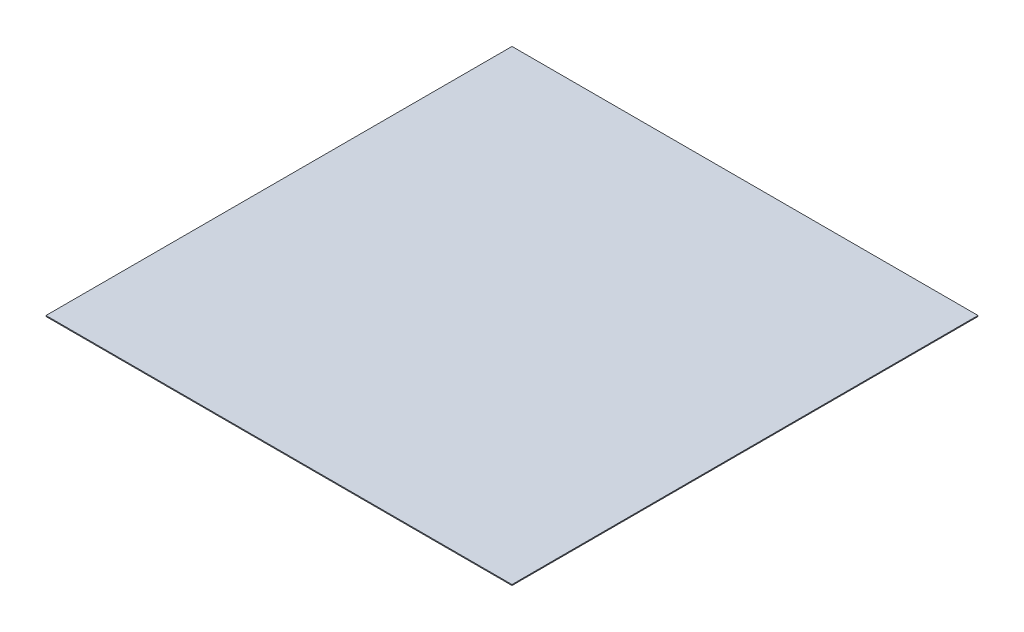
ISO-10303-21;
HEADER;
FILE_DESCRIPTION(('STEP AP214'),'2;1');
FILE_NAME('part.step','',(''),(''),'','','');
FILE_SCHEMA(('AUTOMOTIVE_DESIGN { 1 0 10303 214 1 1 1 1 }'));
ENDSEC;
DATA;
#1=APPLICATION_CONTEXT('core data for automotive mechanical design processes');
#2=APPLICATION_PROTOCOL_DEFINITION('international standard','automotive_design',2000,#1);
#3=PRODUCT_CONTEXT('',#1,'mechanical');
#4=PRODUCT('Part','Part','',(#3));
#5=PRODUCT_RELATED_PRODUCT_CATEGORY('part','',(#4));
#6=PRODUCT_DEFINITION_FORMATION('','',#4);
#7=PRODUCT_DEFINITION_CONTEXT('part definition',#1,'design');
#8=PRODUCT_DEFINITION('design','',#6,#7);
#9=PRODUCT_DEFINITION_SHAPE('','',#8);
#10=(LENGTH_UNIT() NAMED_UNIT(*) SI_UNIT(.MILLI.,.METRE.));
#11=(NAMED_UNIT(*) PLANE_ANGLE_UNIT() SI_UNIT($,.RADIAN.));
#12=(NAMED_UNIT(*) SI_UNIT($,.STERADIAN.) SOLID_ANGLE_UNIT());
#13=UNCERTAINTY_MEASURE_WITH_UNIT(LENGTH_MEASURE(1.E-05),#10,'distance_accuracy_value','');
#14=(GEOMETRIC_REPRESENTATION_CONTEXT(3) GLOBAL_UNCERTAINTY_ASSIGNED_CONTEXT((#13)) GLOBAL_UNIT_ASSIGNED_CONTEXT((#10,
#11,#12)) REPRESENTATION_CONTEXT('',''));
#15=CARTESIAN_POINT('',(0.,0.,0.));
#16=DIRECTION('',(0.,0.,1.));
#17=DIRECTION('',(1.,0.,0.));
#18=AXIS2_PLACEMENT_3D('',#15,#16,#17);
#19=CARTESIAN_POINT('',(0.,2.,0.));
#20=DIRECTION('',(-1.,0.,0.));
#21=DIRECTION('',(0.,0.,1.));
#22=AXIS2_PLACEMENT_3D('',#19,#20,#21);
#23=PLANE('',#22);
#24=DIRECTION('',(0.,0.,-1.));
#25=VECTOR('',#24,1.);
#26=CARTESIAN_POINT('',(0.,0.,0.));
#27=LINE('',#26,#25);
#28=CARTESIAN_POINT('',(0.,0.,0.));
#29=VERTEX_POINT('',#28);
#30=CARTESIAN_POINT('',(0.,0.,-1000.));
#31=VERTEX_POINT('',#30);
#32=EDGE_CURVE('E98',#29,#31,#27,.T.);
#33=ORIENTED_EDGE('',*,*,#32,.F.);
#34=DIRECTION('',(0.,-1.,0.));
#35=VECTOR('',#34,1.);
#36=CARTESIAN_POINT('',(0.,2.,0.));
#37=LINE('',#36,#35);
#38=CARTESIAN_POINT('',(0.,2.,0.));
#39=VERTEX_POINT('',#38);
#40=EDGE_CURVE('E11',#39,#29,#37,.T.);
#41=ORIENTED_EDGE('',*,*,#40,.F.);
#42=DIRECTION('',(0.,0.,-1.));
#43=VECTOR('',#42,1.);
#44=CARTESIAN_POINT('',(0.,2.,0.));
#45=LINE('',#44,#43);
#46=CARTESIAN_POINT('',(0.,2.,-1000.));
#47=VERTEX_POINT('',#46);
#48=EDGE_CURVE('E93',#39,#47,#45,.T.);
#49=ORIENTED_EDGE('',*,*,#48,.T.);
#50=DIRECTION('',(0.,-1.,0.));
#51=VECTOR('',#50,1.);
#52=CARTESIAN_POINT('',(0.,2.,-1000.));
#53=LINE('',#52,#51);
#54=EDGE_CURVE('E36',#47,#31,#53,.T.);
#55=ORIENTED_EDGE('',*,*,#54,.T.);
#56=EDGE_LOOP('',(#33,#41,#49,#55));
#57=FACE_BOUND('',#56,.T.);
#58=ADVANCED_FACE('F33',(#57),#23,.T.);
#59=CARTESIAN_POINT('',(0.,2.,0.));
#60=DIRECTION('',(0.,0.,-1.));
#61=DIRECTION('',(-1.,0.,0.));
#62=AXIS2_PLACEMENT_3D('',#59,#60,#61);
#63=PLANE('',#62);
#64=DIRECTION('',(1.,0.,0.));
#65=VECTOR('',#64,1.);
#66=CARTESIAN_POINT('',(0.,0.,0.));
#67=LINE('',#66,#65);
#68=CARTESIAN_POINT('',(1000.,0.,0.));
#69=VERTEX_POINT('',#68);
#70=EDGE_CURVE('E66',#29,#69,#67,.T.);
#71=ORIENTED_EDGE('',*,*,#70,.T.);
#72=DIRECTION('',(0.,-1.,0.));
#73=VECTOR('',#72,1.);
#74=CARTESIAN_POINT('',(1000.,2.,0.));
#75=LINE('',#74,#73);
#76=CARTESIAN_POINT('',(1000.,2.,0.));
#77=VERTEX_POINT('',#76);
#78=EDGE_CURVE('E42',#77,#69,#75,.T.);
#79=ORIENTED_EDGE('',*,*,#78,.F.);
#80=DIRECTION('',(1.,0.,0.));
#81=VECTOR('',#80,1.);
#82=CARTESIAN_POINT('',(0.,2.,0.));
#83=LINE('',#82,#81);
#84=EDGE_CURVE('E83',#39,#77,#83,.T.);
#85=ORIENTED_EDGE('',*,*,#84,.F.);
#86=ORIENTED_EDGE('',*,*,#40,.T.);
#87=EDGE_LOOP('',(#71,#79,#85,#86));
#88=FACE_BOUND('',#87,.T.);
#89=ADVANCED_FACE('F108',(#88),#63,.F.);
#90=CARTESIAN_POINT('',(1000.,2.,0.));
#91=DIRECTION('',(-1.,0.,0.));
#92=DIRECTION('',(0.,0.,1.));
#93=AXIS2_PLACEMENT_3D('',#90,#91,#92);
#94=PLANE('',#93);
#95=DIRECTION('',(0.,0.,-1.));
#96=VECTOR('',#95,1.);
#97=CARTESIAN_POINT('',(1000.,0.,0.));
#98=LINE('',#97,#96);
#99=CARTESIAN_POINT('',(1000.,0.,-1000.));
#100=VERTEX_POINT('',#99);
#101=EDGE_CURVE('E90',#69,#100,#98,.T.);
#102=ORIENTED_EDGE('',*,*,#101,.T.);
#103=DIRECTION('',(0.,-1.,0.));
#104=VECTOR('',#103,1.);
#105=CARTESIAN_POINT('',(1000.,2.,-1000.));
#106=LINE('',#105,#104);
#107=CARTESIAN_POINT('',(1000.,2.,-1000.));
#108=VERTEX_POINT('',#107);
#109=EDGE_CURVE('E87',#108,#100,#106,.T.);
#110=ORIENTED_EDGE('',*,*,#109,.F.);
#111=DIRECTION('',(0.,0.,-1.));
#112=VECTOR('',#111,1.);
#113=CARTESIAN_POINT('',(1000.,2.,0.));
#114=LINE('',#113,#112);
#115=EDGE_CURVE('E78',#77,#108,#114,.T.);
#116=ORIENTED_EDGE('',*,*,#115,.F.);
#117=ORIENTED_EDGE('',*,*,#78,.T.);
#118=EDGE_LOOP('',(#102,#110,#116,#117));
#119=FACE_BOUND('',#118,.T.);
#120=ADVANCED_FACE('F88',(#119),#94,.F.);
#121=CARTESIAN_POINT('',(0.,2.,-1000.));
#122=DIRECTION('',(0.,0.,-1.));
#123=DIRECTION('',(-1.,0.,0.));
#124=AXIS2_PLACEMENT_3D('',#121,#122,#123);
#125=PLANE('',#124);
#126=DIRECTION('',(1.,0.,0.));
#127=VECTOR('',#126,1.);
#128=CARTESIAN_POINT('',(0.,0.,-1000.));
#129=LINE('',#128,#127);
#130=EDGE_CURVE('E101',#31,#100,#129,.T.);
#131=ORIENTED_EDGE('',*,*,#130,.F.);
#132=ORIENTED_EDGE('',*,*,#54,.F.);
#133=DIRECTION('',(1.,0.,0.));
#134=VECTOR('',#133,1.);
#135=CARTESIAN_POINT('',(0.,2.,-1000.));
#136=LINE('',#135,#134);
#137=EDGE_CURVE('E82',#47,#108,#136,.T.);
#138=ORIENTED_EDGE('',*,*,#137,.T.);
#139=ORIENTED_EDGE('',*,*,#109,.T.);
#140=EDGE_LOOP('',(#131,#132,#138,#139));
#141=FACE_BOUND('',#140,.T.);
#142=ADVANCED_FACE('F92',(#141),#125,.T.);
#143=CARTESIAN_POINT('',(0.,2.,0.));
#144=DIRECTION('',(0.,-1.,0.));
#145=DIRECTION('',(0.,0.,-1.));
#146=AXIS2_PLACEMENT_3D('',#143,#144,#145);
#147=PLANE('',#146);
#148=ORIENTED_EDGE('',*,*,#48,.F.);
#149=ORIENTED_EDGE('',*,*,#84,.T.);
#150=ORIENTED_EDGE('',*,*,#115,.T.);
#151=ORIENTED_EDGE('',*,*,#137,.F.);
#152=EDGE_LOOP('',(#148,#149,#150,#151));
#153=FACE_BOUND('',#152,.T.);
#154=ADVANCED_FACE('F81',(#153),#147,.F.);
#155=CARTESIAN_POINT('',(0.,0.,0.));
#156=DIRECTION('',(0.,-1.,0.));
#157=DIRECTION('',(0.,0.,-1.));
#158=AXIS2_PLACEMENT_3D('',#155,#156,#157);
#159=PLANE('',#158);
#160=ORIENTED_EDGE('',*,*,#32,.T.);
#161=ORIENTED_EDGE('',*,*,#130,.T.);
#162=ORIENTED_EDGE('',*,*,#101,.F.);
#163=ORIENTED_EDGE('',*,*,#70,.F.);
#164=EDGE_LOOP('',(#160,#161,#162,#163));
#165=FACE_BOUND('',#164,.T.);
#166=ADVANCED_FACE('F106',(#165),#159,.T.);
#167=CLOSED_SHELL('',(#58,#89,#120,#142,#154,#166));
#168=MANIFOLD_SOLID_BREP('B2',#167);
#169=ADVANCED_BREP_SHAPE_REPRESENTATION('',(#18,#168),#14);
#170=SHAPE_DEFINITION_REPRESENTATION(#9,#169);
ENDSEC;
END-ISO-10303-21;
